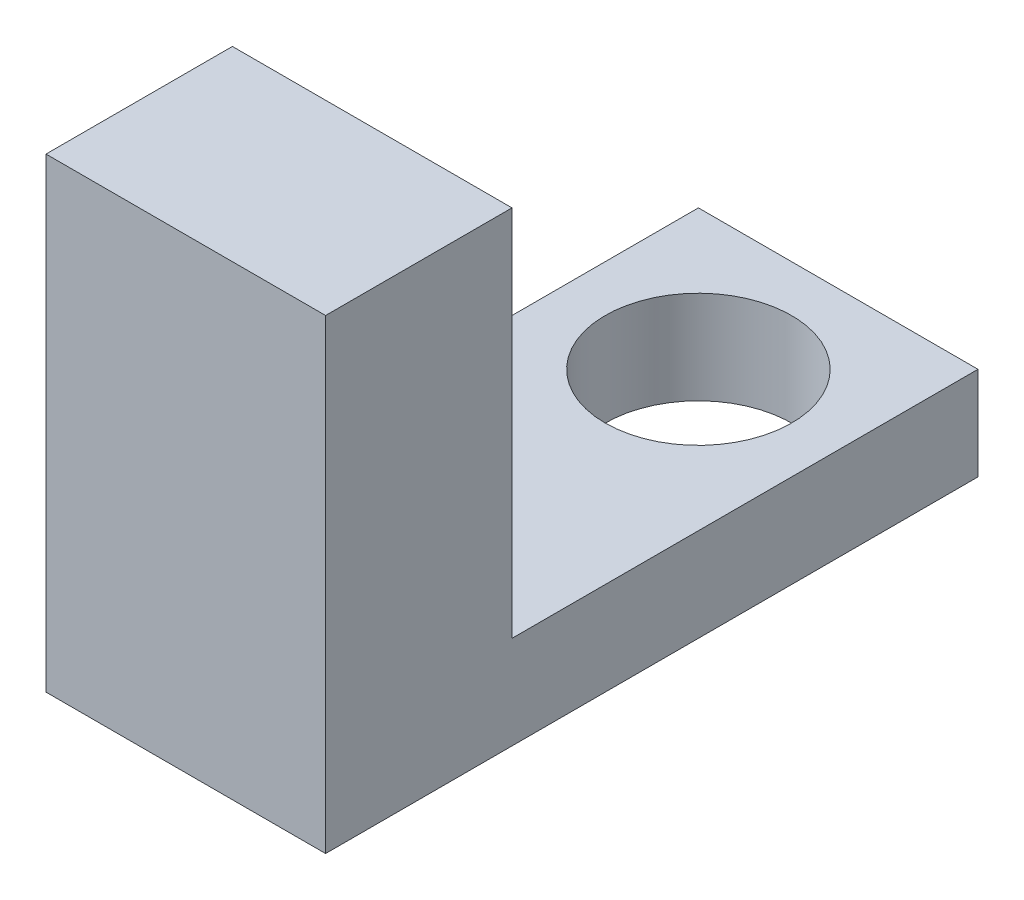
ISO-10303-21;
HEADER;
FILE_DESCRIPTION(('STEP AP214'),'2;1');
FILE_NAME('part.step','',(''),(''),'','','');
FILE_SCHEMA(('AUTOMOTIVE_DESIGN { 1 0 10303 214 1 1 1 1 }'));
ENDSEC;
DATA;
#1=APPLICATION_CONTEXT('core data for automotive mechanical design processes');
#2=APPLICATION_PROTOCOL_DEFINITION('international standard','automotive_design',2000,#1);
#3=PRODUCT_CONTEXT('',#1,'mechanical');
#4=PRODUCT('Part','Part','',(#3));
#5=PRODUCT_RELATED_PRODUCT_CATEGORY('part','',(#4));
#6=PRODUCT_DEFINITION_FORMATION('','',#4);
#7=PRODUCT_DEFINITION_CONTEXT('part definition',#1,'design');
#8=PRODUCT_DEFINITION('design','',#6,#7);
#9=PRODUCT_DEFINITION_SHAPE('','',#8);
#10=(LENGTH_UNIT() NAMED_UNIT(*) SI_UNIT(.MILLI.,.METRE.));
#11=(NAMED_UNIT(*) PLANE_ANGLE_UNIT() SI_UNIT($,.RADIAN.));
#12=(NAMED_UNIT(*) SI_UNIT($,.STERADIAN.) SOLID_ANGLE_UNIT());
#13=UNCERTAINTY_MEASURE_WITH_UNIT(LENGTH_MEASURE(1.E-05),#10,'distance_accuracy_value','');
#14=(GEOMETRIC_REPRESENTATION_CONTEXT(3) GLOBAL_UNCERTAINTY_ASSIGNED_CONTEXT((#13)) GLOBAL_UNIT_ASSIGNED_CONTEXT((#10,
#11,#12)) REPRESENTATION_CONTEXT('',''));
#15=CARTESIAN_POINT('',(0.,0.,0.));
#16=DIRECTION('',(0.,0.,1.));
#17=DIRECTION('',(1.,0.,0.));
#18=AXIS2_PLACEMENT_3D('',#15,#16,#17);
#19=CARTESIAN_POINT('',(30.,0.,0.));
#20=DIRECTION('',(0.,-1.,0.));
#21=DIRECTION('',(0.,0.,-1.));
#22=AXIS2_PLACEMENT_3D('',#19,#20,#21);
#23=PLANE('',#22);
#24=CARTESIAN_POINT('',(15.,0.,-35.));
#25=DIRECTION('',(0.,1.,0.));
#26=DIRECTION('',(0.,0.,1.));
#27=AXIS2_PLACEMENT_3D('',#24,#25,#26);
#28=CIRCLE('',#27,10.);
#29=CARTESIAN_POINT('',(15.,0.,-25.));
#30=VERTEX_POINT('',#29);
#31=EDGE_CURVE('E182',#30,#30,#28,.T.);
#32=ORIENTED_EDGE('',*,*,#31,.F.);
#33=EDGE_LOOP('',(#32));
#34=FACE_BOUND('',#33,.T.);
#35=DIRECTION('',(0.,0.,1.));
#36=VECTOR('',#35,1.);
#37=CARTESIAN_POINT('',(0.,0.,0.));
#38=LINE('',#37,#36);
#39=CARTESIAN_POINT('',(0.,0.,-50.));
#40=VERTEX_POINT('',#39);
#41=CARTESIAN_POINT('',(0.,0.,0.));
#42=VERTEX_POINT('',#41);
#43=EDGE_CURVE('E127',#40,#42,#38,.T.);
#44=ORIENTED_EDGE('',*,*,#43,.T.);
#45=DIRECTION('',(-1.,0.,0.));
#46=VECTOR('',#45,1.);
#47=CARTESIAN_POINT('',(30.,0.,0.));
#48=LINE('',#47,#46);
#49=CARTESIAN_POINT('',(30.,0.,0.));
#50=VERTEX_POINT('',#49);
#51=EDGE_CURVE('E11',#50,#42,#48,.T.);
#52=ORIENTED_EDGE('',*,*,#51,.F.);
#53=DIRECTION('',(0.,0.,1.));
#54=VECTOR('',#53,1.);
#55=CARTESIAN_POINT('',(30.,0.,0.));
#56=LINE('',#55,#54);
#57=CARTESIAN_POINT('',(30.,0.,-50.));
#58=VERTEX_POINT('',#57);
#59=EDGE_CURVE('E144',#58,#50,#56,.T.);
#60=ORIENTED_EDGE('',*,*,#59,.F.);
#61=DIRECTION('',(-1.,0.,0.));
#62=VECTOR('',#61,1.);
#63=CARTESIAN_POINT('',(30.,0.,-50.));
#64=LINE('',#63,#62);
#65=EDGE_CURVE('E123',#58,#40,#64,.T.);
#66=ORIENTED_EDGE('',*,*,#65,.T.);
#67=EDGE_LOOP('',(#44,#52,#60,#66));
#68=FACE_BOUND('',#67,.T.);
#69=ADVANCED_FACE('F38',(#34,#68),#23,.F.);
#70=CARTESIAN_POINT('',(30.,40.,0.));
#71=DIRECTION('',(0.,0.,1.));
#72=DIRECTION('',(0.,-1.,0.));
#73=AXIS2_PLACEMENT_3D('',#70,#71,#72);
#74=PLANE('',#73);
#75=DIRECTION('',(0.,1.,0.));
#76=VECTOR('',#75,1.);
#77=CARTESIAN_POINT('',(0.,40.,0.));
#78=LINE('',#77,#76);
#79=CARTESIAN_POINT('',(0.,40.,0.));
#80=VERTEX_POINT('',#79);
#81=EDGE_CURVE('E131',#42,#80,#78,.T.);
#82=ORIENTED_EDGE('',*,*,#81,.T.);
#83=DIRECTION('',(-1.,0.,0.));
#84=VECTOR('',#83,1.);
#85=CARTESIAN_POINT('',(30.,40.,0.));
#86=LINE('',#85,#84);
#87=CARTESIAN_POINT('',(30.,40.,0.));
#88=VERTEX_POINT('',#87);
#89=EDGE_CURVE('E47',#88,#80,#86,.T.);
#90=ORIENTED_EDGE('',*,*,#89,.F.);
#91=DIRECTION('',(0.,1.,0.));
#92=VECTOR('',#91,1.);
#93=CARTESIAN_POINT('',(30.,40.,0.));
#94=LINE('',#93,#92);
#95=EDGE_CURVE('E92',#50,#88,#94,.T.);
#96=ORIENTED_EDGE('',*,*,#95,.F.);
#97=ORIENTED_EDGE('',*,*,#51,.T.);
#98=EDGE_LOOP('',(#82,#90,#96,#97));
#99=FACE_BOUND('',#98,.T.);
#100=ADVANCED_FACE('F174',(#99),#74,.F.);
#101=CARTESIAN_POINT('',(30.,40.,20.));
#102=DIRECTION('',(0.,-1.,0.));
#103=DIRECTION('',(0.,0.,-1.));
#104=AXIS2_PLACEMENT_3D('',#101,#102,#103);
#105=PLANE('',#104);
#106=DIRECTION('',(0.,0.,1.));
#107=VECTOR('',#106,1.);
#108=CARTESIAN_POINT('',(0.,40.,20.));
#109=LINE('',#108,#107);
#110=CARTESIAN_POINT('',(0.,40.,20.));
#111=VERTEX_POINT('',#110);
#112=EDGE_CURVE('E135',#80,#111,#109,.T.);
#113=ORIENTED_EDGE('',*,*,#112,.T.);
#114=DIRECTION('',(-1.,0.,0.));
#115=VECTOR('',#114,1.);
#116=CARTESIAN_POINT('',(30.,40.,20.));
#117=LINE('',#116,#115);
#118=CARTESIAN_POINT('',(30.,40.,20.));
#119=VERTEX_POINT('',#118);
#120=EDGE_CURVE('E116',#119,#111,#117,.T.);
#121=ORIENTED_EDGE('',*,*,#120,.F.);
#122=DIRECTION('',(0.,0.,1.));
#123=VECTOR('',#122,1.);
#124=CARTESIAN_POINT('',(30.,40.,20.));
#125=LINE('',#124,#123);
#126=EDGE_CURVE('E105',#88,#119,#125,.T.);
#127=ORIENTED_EDGE('',*,*,#126,.F.);
#128=ORIENTED_EDGE('',*,*,#89,.T.);
#129=EDGE_LOOP('',(#113,#121,#127,#128));
#130=FACE_BOUND('',#129,.T.);
#131=ADVANCED_FACE('F154',(#130),#105,.F.);
#132=CARTESIAN_POINT('',(30.,-10.,20.));
#133=DIRECTION('',(0.,0.,-1.));
#134=DIRECTION('',(-1.,0.,0.));
#135=AXIS2_PLACEMENT_3D('',#132,#133,#134);
#136=PLANE('',#135);
#137=DIRECTION('',(0.,-1.,0.));
#138=VECTOR('',#137,1.);
#139=CARTESIAN_POINT('',(0.,-10.,20.));
#140=LINE('',#139,#138);
#141=CARTESIAN_POINT('',(0.,-10.,20.));
#142=VERTEX_POINT('',#141);
#143=EDGE_CURVE('E114',#111,#142,#140,.T.);
#144=ORIENTED_EDGE('',*,*,#143,.T.);
#145=DIRECTION('',(-1.,0.,0.));
#146=VECTOR('',#145,1.);
#147=CARTESIAN_POINT('',(30.,-10.,20.));
#148=LINE('',#147,#146);
#149=CARTESIAN_POINT('',(30.,-10.,20.));
#150=VERTEX_POINT('',#149);
#151=EDGE_CURVE('E111',#150,#142,#148,.T.);
#152=ORIENTED_EDGE('',*,*,#151,.F.);
#153=DIRECTION('',(0.,-1.,0.));
#154=VECTOR('',#153,1.);
#155=CARTESIAN_POINT('',(30.,-10.,20.));
#156=LINE('',#155,#154);
#157=EDGE_CURVE('E99',#119,#150,#156,.T.);
#158=ORIENTED_EDGE('',*,*,#157,.F.);
#159=ORIENTED_EDGE('',*,*,#120,.T.);
#160=EDGE_LOOP('',(#144,#152,#158,#159));
#161=FACE_BOUND('',#160,.T.);
#162=ADVANCED_FACE('F112',(#161),#136,.F.);
#163=CARTESIAN_POINT('',(30.,-10.,-50.));
#164=DIRECTION('',(0.,1.,0.));
#165=DIRECTION('',(0.,0.,1.));
#166=AXIS2_PLACEMENT_3D('',#163,#164,#165);
#167=PLANE('',#166);
#168=CARTESIAN_POINT('',(15.,-10.,-35.));
#169=DIRECTION('',(0.,1.,0.));
#170=DIRECTION('',(0.,0.,1.));
#171=AXIS2_PLACEMENT_3D('',#168,#169,#170);
#172=CIRCLE('',#171,10.);
#173=CARTESIAN_POINT('',(15.,-10.,-25.));
#174=VERTEX_POINT('',#173);
#175=EDGE_CURVE('E132',#174,#174,#172,.T.);
#176=ORIENTED_EDGE('',*,*,#175,.T.);
#177=EDGE_LOOP('',(#176));
#178=FACE_BOUND('',#177,.T.);
#179=DIRECTION('',(0.,0.,-1.));
#180=VECTOR('',#179,1.);
#181=CARTESIAN_POINT('',(0.,-10.,-50.));
#182=LINE('',#181,#180);
#183=CARTESIAN_POINT('',(0.,-10.,-50.));
#184=VERTEX_POINT('',#183);
#185=EDGE_CURVE('E78',#142,#184,#182,.T.);
#186=ORIENTED_EDGE('',*,*,#185,.T.);
#187=DIRECTION('',(-1.,0.,0.));
#188=VECTOR('',#187,1.);
#189=CARTESIAN_POINT('',(30.,-10.,-50.));
#190=LINE('',#189,#188);
#191=CARTESIAN_POINT('',(30.,-10.,-50.));
#192=VERTEX_POINT('',#191);
#193=EDGE_CURVE('E117',#192,#184,#190,.T.);
#194=ORIENTED_EDGE('',*,*,#193,.F.);
#195=DIRECTION('',(0.,0.,-1.));
#196=VECTOR('',#195,1.);
#197=CARTESIAN_POINT('',(30.,-10.,-50.));
#198=LINE('',#197,#196);
#199=EDGE_CURVE('E103',#150,#192,#198,.T.);
#200=ORIENTED_EDGE('',*,*,#199,.F.);
#201=ORIENTED_EDGE('',*,*,#151,.T.);
#202=EDGE_LOOP('',(#186,#194,#200,#201));
#203=FACE_BOUND('',#202,.T.);
#204=ADVANCED_FACE('F119',(#178,#203),#167,.F.);
#205=CARTESIAN_POINT('',(30.,0.,-50.));
#206=DIRECTION('',(0.,0.,1.));
#207=DIRECTION('',(1.,0.,0.));
#208=AXIS2_PLACEMENT_3D('',#205,#206,#207);
#209=PLANE('',#208);
#210=DIRECTION('',(0.,1.,0.));
#211=VECTOR('',#210,1.);
#212=CARTESIAN_POINT('',(0.,0.,-50.));
#213=LINE('',#212,#211);
#214=EDGE_CURVE('E84',#184,#40,#213,.T.);
#215=ORIENTED_EDGE('',*,*,#214,.T.);
#216=ORIENTED_EDGE('',*,*,#65,.F.);
#217=DIRECTION('',(0.,1.,0.));
#218=VECTOR('',#217,1.);
#219=CARTESIAN_POINT('',(30.,0.,-50.));
#220=LINE('',#219,#218);
#221=EDGE_CURVE('E55',#192,#58,#220,.T.);
#222=ORIENTED_EDGE('',*,*,#221,.F.);
#223=ORIENTED_EDGE('',*,*,#193,.T.);
#224=EDGE_LOOP('',(#215,#216,#222,#223));
#225=FACE_BOUND('',#224,.T.);
#226=ADVANCED_FACE('F161',(#225),#209,.F.);
#227=CARTESIAN_POINT('',(30.,0.,0.));
#228=DIRECTION('',(-1.,0.,0.));
#229=DIRECTION('',(0.,0.,1.));
#230=AXIS2_PLACEMENT_3D('',#227,#228,#229);
#231=PLANE('',#230);
#232=ORIENTED_EDGE('',*,*,#59,.T.);
#233=ORIENTED_EDGE('',*,*,#95,.T.);
#234=ORIENTED_EDGE('',*,*,#126,.T.);
#235=ORIENTED_EDGE('',*,*,#157,.T.);
#236=ORIENTED_EDGE('',*,*,#199,.T.);
#237=ORIENTED_EDGE('',*,*,#221,.T.);
#238=EDGE_LOOP('',(#232,#233,#234,#235,#236,#237));
#239=FACE_BOUND('',#238,.T.);
#240=ADVANCED_FACE('F101',(#239),#231,.F.);
#241=CARTESIAN_POINT('',(0.,0.,0.));
#242=DIRECTION('',(-1.,0.,0.));
#243=DIRECTION('',(0.,0.,1.));
#244=AXIS2_PLACEMENT_3D('',#241,#242,#243);
#245=PLANE('',#244);
#246=ORIENTED_EDGE('',*,*,#43,.F.);
#247=ORIENTED_EDGE('',*,*,#214,.F.);
#248=ORIENTED_EDGE('',*,*,#185,.F.);
#249=ORIENTED_EDGE('',*,*,#143,.F.);
#250=ORIENTED_EDGE('',*,*,#112,.F.);
#251=ORIENTED_EDGE('',*,*,#81,.F.);
#252=EDGE_LOOP('',(#246,#247,#248,#249,#250,#251));
#253=FACE_BOUND('',#252,.T.);
#254=ADVANCED_FACE('F157',(#253),#245,.T.);
#255=CARTESIAN_POINT('',(15.,-10.,-35.));
#256=DIRECTION('',(0.,1.,0.));
#257=DIRECTION('',(0.,0.,1.));
#258=AXIS2_PLACEMENT_3D('',#255,#256,#257);
#259=CYLINDRICAL_SURFACE('',#258,10.);
#260=ORIENTED_EDGE('',*,*,#175,.F.);
#261=EDGE_LOOP('',(#260));
#262=FACE_BOUND('',#261,.T.);
#263=ORIENTED_EDGE('',*,*,#31,.T.);
#264=EDGE_LOOP('',(#263));
#265=FACE_BOUND('',#264,.T.);
#266=ADVANCED_FACE('F196',(#262,#265),#259,.F.);
#267=CLOSED_SHELL('',(#69,#100,#131,#162,#204,#226,#240,#254,#266));
#268=MANIFOLD_SOLID_BREP('B2',#267);
#269=ADVANCED_BREP_SHAPE_REPRESENTATION('',(#18,#268),#14);
#270=SHAPE_DEFINITION_REPRESENTATION(#9,#269);
ENDSEC;
END-ISO-10303-21;
